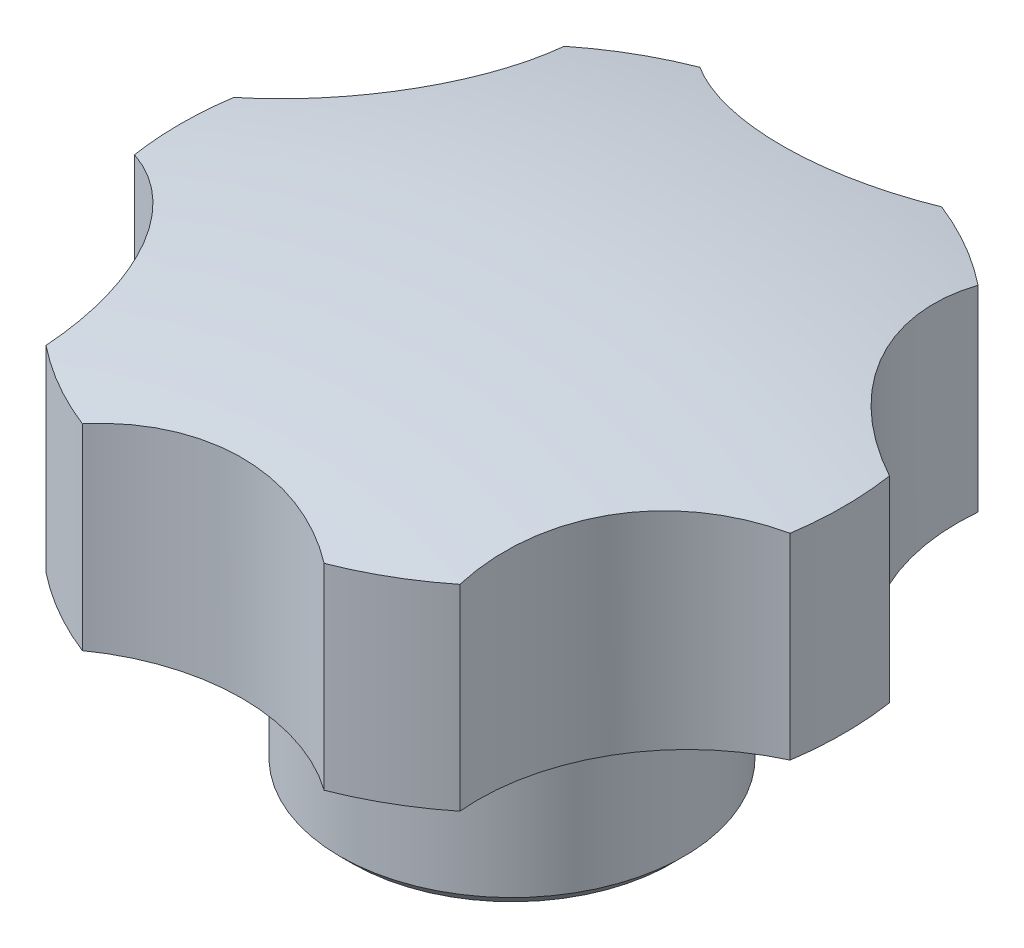
ISO-10303-21;
HEADER;
FILE_DESCRIPTION(('STEP AP214'),'2;1');
FILE_NAME('part.step','',(''),(''),'','','');
FILE_SCHEMA(('AUTOMOTIVE_DESIGN { 1 0 10303 214 1 1 1 1 }'));
ENDSEC;
DATA;
#1=APPLICATION_CONTEXT('core data for automotive mechanical design processes');
#2=APPLICATION_PROTOCOL_DEFINITION('international standard','automotive_design',2000,#1);
#3=PRODUCT_CONTEXT('',#1,'mechanical');
#4=PRODUCT('Part','Part','',(#3));
#5=PRODUCT_RELATED_PRODUCT_CATEGORY('part','',(#4));
#6=PRODUCT_DEFINITION_FORMATION('','',#4);
#7=PRODUCT_DEFINITION_CONTEXT('part definition',#1,'design');
#8=PRODUCT_DEFINITION('design','',#6,#7);
#9=PRODUCT_DEFINITION_SHAPE('','',#8);
#10=(LENGTH_UNIT() NAMED_UNIT(*) SI_UNIT(.MILLI.,.METRE.));
#11=(NAMED_UNIT(*) PLANE_ANGLE_UNIT() SI_UNIT($,.RADIAN.));
#12=(NAMED_UNIT(*) SI_UNIT($,.STERADIAN.) SOLID_ANGLE_UNIT());
#13=UNCERTAINTY_MEASURE_WITH_UNIT(LENGTH_MEASURE(1.E-05),#10,'distance_accuracy_value','');
#14=(GEOMETRIC_REPRESENTATION_CONTEXT(3) GLOBAL_UNCERTAINTY_ASSIGNED_CONTEXT((#13)) GLOBAL_UNIT_ASSIGNED_CONTEXT((#10,
#11,#12)) REPRESENTATION_CONTEXT('',''));
#15=CARTESIAN_POINT('',(0.,0.,0.));
#16=DIRECTION('',(0.,0.,1.));
#17=DIRECTION('',(1.,0.,0.));
#18=AXIS2_PLACEMENT_3D('',#15,#16,#17);
#19=CARTESIAN_POINT('',(0.,51.0944881889764,0.));
#20=DIRECTION('',(0.,1.,0.));
#21=DIRECTION('',(0.,0.,1.));
#22=AXIS2_PLACEMENT_3D('',#19,#20,#21);
#23=CYLINDRICAL_SURFACE('',#22,27.);
#24=DIRECTION('',(0.,-1.,0.));
#25=VECTOR('',#24,1.);
#26=CARTESIAN_POINT('',(-16.850144874763,8.08262341237582,21.0967442440652));
#27=LINE('',#26,#25);
#28=CARTESIAN_POINT('',(-16.850144874763,-1.33475317524839,21.0967442440652));
#29=VERTEX_POINT('',#28);
#30=CARTESIAN_POINT('',(-16.850144874763,14.6652468247516,21.0967442440652));
#31=VERTEX_POINT('',#30);
#32=EDGE_CURVE('E11',#29,#31,#27,.F.);
#33=ORIENTED_EDGE('',*,*,#32,.F.);
#34=CARTESIAN_POINT('',(0.,-1.33475317524839,0.));
#35=DIRECTION('',(0.,1.,0.));
#36=DIRECTION('',(0.,0.,1.));
#37=AXIS2_PLACEMENT_3D('',#34,#35,#36);
#38=CIRCLE('',#37,27.);
#39=CARTESIAN_POINT('',(-9.84524401512177,-1.33475317524839,25.1410256410256));
#40=VERTEX_POINT('',#39);
#41=EDGE_CURVE('E215',#29,#40,#38,.T.);
#42=ORIENTED_EDGE('',*,*,#41,.T.);
#43=DIRECTION('',(0.,-1.,0.));
#44=VECTOR('',#43,1.);
#45=CARTESIAN_POINT('',(-9.84524401512178,8.08262341237582,25.1410256410256));
#46=LINE('',#45,#44);
#47=CARTESIAN_POINT('',(-9.84524401512179,14.6652468247516,25.1410256410256));
#48=VERTEX_POINT('',#47);
#49=EDGE_CURVE('E238',#48,#40,#46,.T.);
#50=ORIENTED_EDGE('',*,*,#49,.F.);
#51=CARTESIAN_POINT('',(0.,14.6652468247516,0.));
#52=DIRECTION('',(0.,1.,0.));
#53=DIRECTION('',(0.,0.,1.));
#54=AXIS2_PLACEMENT_3D('',#51,#52,#53);
#55=CIRCLE('',#54,27.);
#56=EDGE_CURVE('E208',#31,#48,#55,.T.);
#57=ORIENTED_EDGE('',*,*,#56,.F.);
#58=EDGE_LOOP('',(#33,#42,#50,#57));
#59=FACE_BOUND('',#58,.T.);
#60=ADVANCED_FACE('F41',(#59),#23,.T.);
#61=DIRECTION('',(0.,-1.,0.));
#62=VECTOR('',#61,1.);
#63=CARTESIAN_POINT('',(-26.695388889885,8.08262341237582,4.04428139696097));
#64=LINE('',#63,#62);
#65=CARTESIAN_POINT('',(-26.695388889885,14.6652468247516,4.04428139696096));
#66=VERTEX_POINT('',#65);
#67=CARTESIAN_POINT('',(-26.695388889885,-1.33475317524839,4.04428139696097));
#68=VERTEX_POINT('',#67);
#69=EDGE_CURVE('E51',#66,#68,#64,.T.);
#70=ORIENTED_EDGE('',*,*,#69,.F.);
#71=CARTESIAN_POINT('',(-26.6953888898851,14.6652468247516,-4.04428139696041));
#72=VERTEX_POINT('',#71);
#73=EDGE_CURVE('E374',#72,#66,#55,.T.);
#74=ORIENTED_EDGE('',*,*,#73,.F.);
#75=DIRECTION('',(0.,-1.,0.));
#76=VECTOR('',#75,1.);
#77=CARTESIAN_POINT('',(-26.6953888898851,8.08262341237582,-4.04428139696041));
#78=LINE('',#77,#76);
#79=CARTESIAN_POINT('',(-26.6953888898851,-1.33475317524839,-4.04428139696041));
#80=VERTEX_POINT('',#79);
#81=EDGE_CURVE('E266',#80,#72,#78,.F.);
#82=ORIENTED_EDGE('',*,*,#81,.F.);
#83=EDGE_CURVE('E281',#80,#68,#38,.T.);
#84=ORIENTED_EDGE('',*,*,#83,.T.);
#85=EDGE_LOOP('',(#70,#74,#82,#84));
#86=FACE_BOUND('',#85,.T.);
#87=ADVANCED_FACE('F284',(#86),#23,.T.);
#88=DIRECTION('',(0.,-1.,0.));
#89=VECTOR('',#88,1.);
#90=CARTESIAN_POINT('',(-16.8501448747635,8.08262341237582,-21.0967442440648));
#91=LINE('',#90,#89);
#92=CARTESIAN_POINT('',(-16.8501448747634,14.6652468247516,-21.0967442440648));
#93=VERTEX_POINT('',#92);
#94=CARTESIAN_POINT('',(-16.8501448747635,-1.33475317524839,-21.0967442440648));
#95=VERTEX_POINT('',#94);
#96=EDGE_CURVE('E263',#93,#95,#91,.T.);
#97=ORIENTED_EDGE('',*,*,#96,.F.);
#98=CARTESIAN_POINT('',(-9.84524401512177,14.6652468247516,-25.1410256410256));
#99=VERTEX_POINT('',#98);
#100=EDGE_CURVE('E370',#99,#93,#55,.T.);
#101=ORIENTED_EDGE('',*,*,#100,.F.);
#102=DIRECTION('',(0.,-1.,0.));
#103=VECTOR('',#102,1.);
#104=CARTESIAN_POINT('',(-9.84524401512178,8.08262341237582,-25.1410256410256));
#105=LINE('',#104,#103);
#106=CARTESIAN_POINT('',(-9.84524401512177,-1.33475317524839,-25.1410256410256));
#107=VERTEX_POINT('',#106);
#108=EDGE_CURVE('E260',#107,#99,#105,.F.);
#109=ORIENTED_EDGE('',*,*,#108,.F.);
#110=EDGE_CURVE('E286',#107,#95,#38,.T.);
#111=ORIENTED_EDGE('',*,*,#110,.T.);
#112=EDGE_LOOP('',(#97,#101,#109,#111));
#113=FACE_BOUND('',#112,.T.);
#114=ADVANCED_FACE('F335',(#113),#23,.T.);
#115=DIRECTION('',(0.,-1.,0.));
#116=VECTOR('',#115,1.);
#117=CARTESIAN_POINT('',(9.84524401512178,8.08262341237582,-25.1410256410256));
#118=LINE('',#117,#116);
#119=CARTESIAN_POINT('',(9.84524401512177,14.6652468247516,-25.1410256410256));
#120=VERTEX_POINT('',#119);
#121=CARTESIAN_POINT('',(9.84524401512177,-1.33475317524839,-25.1410256410256));
#122=VERTEX_POINT('',#121);
#123=EDGE_CURVE('E257',#120,#122,#118,.T.);
#124=ORIENTED_EDGE('',*,*,#123,.F.);
#125=CARTESIAN_POINT('',(16.8501448747632,14.6652468247516,-21.0967442440651));
#126=VERTEX_POINT('',#125);
#127=EDGE_CURVE('E368',#126,#120,#55,.T.);
#128=ORIENTED_EDGE('',*,*,#127,.F.);
#129=DIRECTION('',(0.,-1.,0.));
#130=VECTOR('',#129,1.);
#131=CARTESIAN_POINT('',(16.8501448747632,8.08262341237582,-21.0967442440651));
#132=LINE('',#131,#130);
#133=CARTESIAN_POINT('',(16.8501448747632,-1.33475317524839,-21.0967442440651));
#134=VERTEX_POINT('',#133);
#135=EDGE_CURVE('E254',#134,#126,#132,.F.);
#136=ORIENTED_EDGE('',*,*,#135,.F.);
#137=EDGE_CURVE('E290',#134,#122,#38,.T.);
#138=ORIENTED_EDGE('',*,*,#137,.T.);
#139=EDGE_LOOP('',(#124,#128,#136,#138));
#140=FACE_BOUND('',#139,.T.);
#141=ADVANCED_FACE('F347',(#140),#23,.T.);
#142=DIRECTION('',(0.,-1.,0.));
#143=VECTOR('',#142,1.);
#144=CARTESIAN_POINT('',(26.695388889885,8.08262341237582,-4.04428139696079));
#145=LINE('',#144,#143);
#146=CARTESIAN_POINT('',(26.695388889885,14.6652468247516,-4.04428139696078));
#147=VERTEX_POINT('',#146);
#148=CARTESIAN_POINT('',(26.695388889885,-1.33475317524839,-4.04428139696078));
#149=VERTEX_POINT('',#148);
#150=EDGE_CURVE('E251',#147,#149,#145,.T.);
#151=ORIENTED_EDGE('',*,*,#150,.F.);
#152=CARTESIAN_POINT('',(26.695388889885,14.6652468247516,4.04428139696059));
#153=VERTEX_POINT('',#152);
#154=EDGE_CURVE('E216',#153,#147,#55,.T.);
#155=ORIENTED_EDGE('',*,*,#154,.F.);
#156=DIRECTION('',(0.,-1.,0.));
#157=VECTOR('',#156,1.);
#158=CARTESIAN_POINT('',(26.695388889885,8.08262341237582,4.0442813969606));
#159=LINE('',#158,#157);
#160=CARTESIAN_POINT('',(26.695388889885,-1.33475317524839,4.04428139696059));
#161=VERTEX_POINT('',#160);
#162=EDGE_CURVE('E248',#161,#153,#159,.F.);
#163=ORIENTED_EDGE('',*,*,#162,.F.);
#164=EDGE_CURVE('E222',#161,#149,#38,.T.);
#165=ORIENTED_EDGE('',*,*,#164,.T.);
#166=EDGE_LOOP('',(#151,#155,#163,#165));
#167=FACE_BOUND('',#166,.T.);
#168=ADVANCED_FACE('F338',(#167),#23,.T.);
#169=CARTESIAN_POINT('',(0.,-112.5,0.));
#170=DIRECTION('',(0.,1.,0.));
#171=DIRECTION('',(-1.,0.,0.));
#172=AXIS2_PLACEMENT_3D('',#169,#170,#171);
#173=SPHERICAL_SURFACE('',#172,130.);
#174=CARTESIAN_POINT('',(-16.8501637445967,14.6652111441769,21.0969442440652));
#175=CARTESIAN_POINT('',(-16.8070413013021,14.7466688632916,20.6404213237583));
#176=CARTESIAN_POINT('',(-16.7824070403024,14.8235319502256,20.1813352252558));
#177=CARTESIAN_POINT('',(-16.7704533709237,14.9675571036534,19.2611101541987));
#178=CARTESIAN_POINT('',(-16.7831382340029,15.0347180587411,18.7999709526827));
#179=CARTESIAN_POINT('',(-16.8461817709898,15.1588288644116,17.8786664923407));
#180=CARTESIAN_POINT('',(-16.8965529262544,15.2157753242984,17.4185016068446));
#181=CARTESIAN_POINT('',(-17.0002914915884,15.2931621761796,16.7317689280153));
#182=CARTESIAN_POINT('',(-17.0395688366349,15.3176193131575,16.5034401963426));
#183=CARTESIAN_POINT('',(-17.1274928542011,15.3638215252972,16.0482526350894));
#184=CARTESIAN_POINT('',(-17.1761420144331,15.38556587783,15.8213942123607));
#185=CARTESIAN_POINT('',(-17.3361763754958,15.446692768339,15.1432586787924));
#186=CARTESIAN_POINT('',(-17.4615862906221,15.4819226898528,14.6948334251709));
#187=CARTESIAN_POINT('',(-17.7490544752154,15.5409972705339,13.8091177377044));
#188=CARTESIAN_POINT('',(-17.9111122456536,15.5648420847168,13.3718271523305));
#189=CARTESIAN_POINT('',(-18.1807785067103,15.5919187260886,12.7269020722601));
#190=CARTESIAN_POINT('',(-18.2750782598536,15.5994952739696,12.5137987177617));
#191=CARTESIAN_POINT('',(-18.4723634101261,15.6117421170984,12.0916349352487));
#192=CARTESIAN_POINT('',(-18.5753465577786,15.6164131624204,11.8825734773068));
#193=CARTESIAN_POINT('',(-18.8971108368076,15.6260521024691,11.261931803013));
#194=CARTESIAN_POINT('',(-19.1287304711451,15.6266481758142,10.8568376930189));
#195=CARTESIAN_POINT('',(-19.6203916248729,15.6162523490463,10.0735593541941));
#196=CARTESIAN_POINT('',(-19.879917637532,15.6054461757764,9.69504770317632));
#197=CARTESIAN_POINT('',(-20.4284744108658,15.5726231688262,8.96052297549577));
#198=CARTESIAN_POINT('',(-20.7175059735483,15.5506060303492,8.6045105108228));
#199=CARTESIAN_POINT('',(-21.3230210339595,15.4955283522969,7.91732826985142));
#200=CARTESIAN_POINT('',(-21.6395157989238,15.4624632641065,7.58616879480564));
#201=CARTESIAN_POINT('',(-22.2974675410807,15.3855579608999,6.95107751438354));
#202=CARTESIAN_POINT('',(-22.638921163757,15.3417191920222,6.64714206222356));
#203=CARTESIAN_POINT('',(-23.2752635800438,15.2532101237161,6.12500592320841));
#204=CARTESIAN_POINT('',(-23.5662079801235,15.2103773745234,5.90165957930446));
#205=CARTESIAN_POINT('',(-24.1612034596133,15.118181006556,5.47469626570265));
#206=CARTESIAN_POINT('',(-24.4652529664011,15.0688181699337,5.27107693821969));
#207=CARTESIAN_POINT('',(-25.0845208524167,14.963888122335,4.88464244816682));
#208=CARTESIAN_POINT('',(-25.3997192810911,14.9083316457137,4.70179236730079));
#209=CARTESIAN_POINT('',(-26.0403477116057,14.7912093773338,4.35708783485254));
#210=CARTESIAN_POINT('',(-26.3657784627835,14.7296431447683,4.19523492541361));
#211=CARTESIAN_POINT('',(-26.695588889885,14.6652077527031,4.04418978710369));
#212=B_SPLINE_CURVE_WITH_KNOTS('',3,(#174,#175,#176,#177,#178,#179,#180,#181,#182,#183,#184,
#185,#186,#187,#188,#189,#190,#191,#192,#193,#194,#195,#196,#197,#198,#199,#200,#201,#202,#203,
#204,#205,#206,#207,#208,#209,#210,#211),.UNSPECIFIED.,.F.,.F.,(4,2,2,2,2,2,2,2,2,2,2,2,2,2,2,2,
2,2,4),(0.,1.39679114402809,2.79374216766981,4.19115605369288,4.88988528541168,5.58880024833288,
6.98788412352493,8.38694894873701,9.08623524728681,9.78534094554907,11.1833687895575,
12.5589711663475,13.9346109441608,15.3108177939,16.686840017813,17.7938914500612,
18.9008104031853,20.0058399060644,21.1109505222609),.UNSPECIFIED.);
#213=EDGE_CURVE('E57',#31,#66,#212,.T.);
#214=ORIENTED_EDGE('',*,*,#213,.F.);
#215=ORIENTED_EDGE('',*,*,#56,.T.);
#216=CARTESIAN_POINT('',(9.84544401512177,14.6652032506673,25.141167720724));
#217=CARTESIAN_POINT('',(9.471645448272,14.74666128246,24.8755601261871));
#218=CARTESIAN_POINT('',(9.08638297085149,14.8235246897973,24.6246821499549));
#219=CARTESIAN_POINT('',(8.29542265872542,14.9675504973937,24.1542153217896));
#220=CARTESIAN_POINT('',(7.8897224899787,15.0347117862411,23.9346300545851));
#221=CARTESIAN_POINT('',(7.06032860352918,15.1588232717314,23.5285729236999));
#222=CARTESIAN_POINT('',(6.63662896810968,15.2157700774988,23.3421120564367));
#223=CARTESIAN_POINT('',(5.99003229886148,15.2931574541458,23.088584240493));
#224=CARTESIAN_POINT('',(5.77265531801916,15.3176147670376,23.0084344796747));
#225=CARTESIAN_POINT('',(5.33448963956909,15.3638173327366,22.8569839780837));
#226=CARTESIAN_POINT('',(5.11370005044201,15.3855618629151,22.7856855951581));
#227=CARTESIAN_POINT('',(4.44640067425831,15.4466892889244,22.5852099002971));
#228=CARTESIAN_POINT('',(3.99534827166216,15.481919570311,22.4696042679616));
#229=CARTESIAN_POINT('',(3.08456221933043,15.540994873035,22.2756988090511));
#230=CARTESIAN_POINT('',(2.62482868788412,15.56484004939,22.197398474534));
#231=CARTESIAN_POINT('',(1.93147414120135,15.5919172331554,22.1084719869631));
#232=CARTESIAN_POINT('',(1.69977136349122,15.5994939616376,22.0835856985799));
#233=CARTESIAN_POINT('',(1.23552423638448,15.6117411654266,22.043356574922));
#234=CARTESIAN_POINT('',(1.00298011978993,15.6164123908079,22.0280112765794));
#235=CARTESIAN_POINT('',(0.304606455870692,15.6260518697407,21.99634470895));
#236=CARTESIAN_POINT('',(-0.162025250049129,15.6266483006611,21.9943849664597));
#237=CARTESIAN_POINT('',(-1.08619500004503,15.6162531774943,22.0285345349121));
#238=CARTESIAN_POINT('',(-1.54375884525252,15.6054473519708,22.0640336871773));
#239=CARTESIAN_POINT('',(-2.45415467107692,15.5726250346691,22.1718331607064));
#240=CARTESIAN_POINT('',(-2.90698652271096,15.5506082381158,22.2441344824535));
#241=CARTESIAN_POINT('',(-3.80486190256673,15.4955312347031,22.4249325756522));
#242=CARTESIAN_POINT('',(-4.24990214308657,15.4624664789305,22.5334442564203));
#243=CARTESIAN_POINT('',(-5.1288839691332,15.3855618288022,22.7856994042004));
#244=CARTESIAN_POINT('',(-5.56282703551456,15.3417233805058,22.9294381429828));
#245=CARTESIAN_POINT('',(-6.33318748060469,15.2532142781651,23.2194588932272));
#246=CARTESIAN_POINT('',(-6.67208877809001,15.2103810745442,23.3597524557857));
#247=CARTESIAN_POINT('',(-7.3393582854106,15.1181835922108,23.6615556546006));
#248=CARTESIAN_POINT('',(-7.66772775078251,15.0688200956199,23.8230627501329));
#249=CARTESIAN_POINT('',(-8.31203383711156,14.9638885318095,24.1661521867708));
#250=CARTESIAN_POINT('',(-8.62799072288555,14.9083311989371,24.3476997910669));
#251=CARTESIAN_POINT('',(-9.24683711830454,14.7912070362386,24.7301542015156));
#252=CARTESIAN_POINT('',(-9.54972566717772,14.7296397656495,24.9310624275437));
#253=CARTESIAN_POINT('',(-9.84544401512177,14.6652032506673,25.141167720724));
#254=B_SPLINE_CURVE_WITH_KNOTS('',3,(#216,#217,#218,#219,#220,#221,#222,#223,#224,#225,#226,
#227,#228,#229,#230,#231,#232,#233,#234,#235,#236,#237,#238,#239,#240,#241,#242,#243,#244,#245,
#246,#247,#248,#249,#250,#251,#252,#253),.UNSPECIFIED.,.F.,.F.,(4,2,2,2,2,2,2,2,2,2,2,2,2,2,2,2,
2,2,4),(0.,1.39679144021043,2.79374276111804,4.19115696950711,4.88988636229018,5.58880148638242,
6.98788569041844,8.38695084423601,9.08623729800444,9.78534315144271,11.183371306075,
12.55897379187,13.9346136760206,15.3108206688538,16.6868430461445,17.7939114131476,
18.9008473083549,20.0058937843056,21.1110213642782),.UNSPECIFIED.);
#255=CARTESIAN_POINT('',(9.84524401512177,14.6652468247516,25.1410256410256));
#256=VERTEX_POINT('',#255);
#257=EDGE_CURVE('E199',#256,#48,#254,.T.);
#258=ORIENTED_EDGE('',*,*,#257,.F.);
#259=CARTESIAN_POINT('',(16.8501448747633,14.6652468247516,21.0967442440649));
#260=VERTEX_POINT('',#259);
#261=EDGE_CURVE('E211',#256,#260,#55,.T.);
#262=ORIENTED_EDGE('',*,*,#261,.T.);
#263=CARTESIAN_POINT('',(26.6955888898851,14.6652077527031,4.04418978710332));
#264=CARTESIAN_POINT('',(26.2786669890884,14.746665606332,4.23510565601676));
#265=CARTESIAN_POINT('',(25.8687693825465,14.8235288310802,4.44331435921947));
#266=CARTESIAN_POINT('',(25.0658537172317,14.9675542658356,4.8930738360227));
#267=CARTESIAN_POINT('',(24.6728375959027,15.0347153644344,5.13462842330877));
#268=CARTESIAN_POINT('',(23.9064856806537,15.1588264621069,5.6498771313363));
#269=CARTESIAN_POINT('',(23.5331564507829,15.2157730704504,5.92358187470624));
#270=CARTESIAN_POINT('',(22.9902972731734,15.2931601476034,6.35678787104328));
#271=CARTESIAN_POINT('',(22.8121972879418,15.3176173601034,6.50496722733234));
#272=CARTESIAN_POINT('',(22.4619549457892,15.3638197240426,6.80870507253984));
#273=CARTESIAN_POINT('',(22.2898141850665,15.3855641528529,6.96426551245694));
#274=CARTESIAN_POINT('',(21.7825482029268,15.4466912733037,7.44192657413753));
#275=CARTESIAN_POINT('',(21.4569051080632,15.4819213493689,7.77474703899283));
#276=CARTESIAN_POINT('',(20.8335861055088,15.5409962401938,8.46655900214279));
#277=CARTESIAN_POINT('',(20.5359098170741,15.5648412099699,8.82555014402812));
#278=CARTESIAN_POINT('',(20.1122208010783,15.591918084444,9.38155010140874));
#279=CARTESIAN_POINT('',(19.9748175417599,15.599494709963,9.5697676269784));
#280=CARTESIAN_POINT('',(19.7078551170175,15.6117417081209,9.9517032135206));
#281=CARTESIAN_POINT('',(19.5782939349135,15.6164128308341,10.1454198413502));
#282=CARTESIAN_POINT('',(19.2016839436387,15.6260520024777,10.7343963644137));
#283=CARTESIAN_POINT('',(18.9666715117388,15.6266482294705,11.1375316919378));
#284=CARTESIAN_POINT('',(18.5341622368954,15.6162527049634,11.9549615044078));
#285=CARTESIAN_POINT('',(18.3361240829936,15.605446680999,12.368973256844));
#286=CARTESIAN_POINT('',(17.9742844729358,15.572623969985,13.2112993774181));
#287=CARTESIAN_POINT('',(17.8104839477823,15.5506069781384,13.6396141341214));
#288=CARTESIAN_POINT('',(17.5181232553825,15.4955295895986,14.5075964182568));
#289=CARTESIAN_POINT('',(17.3895776428617,15.4624646442996,14.947268552781));
#290=CARTESIAN_POINT('',(17.1685473730584,15.3855596219866,15.834616939291));
#291=CARTESIAN_POINT('',(17.0760578803042,15.3417209911138,16.282292109565));
#292=CARTESIAN_POINT('',(16.9420450788196,15.2532121797384,17.0944486725962));
#293=CARTESIAN_POINT('',(16.8940932957713,15.2103795527524,17.4580869404735));
#294=CARTESIAN_POINT('',(16.8218291946991,15.1181834292686,18.1868495325122));
#295=CARTESIAN_POINT('',(16.7975140484584,15.0688207149249,18.5519736736318));
#296=CARTESIAN_POINT('',(16.7724851163354,14.9638909110643,19.2814924282256));
#297=CARTESIAN_POINT('',(16.7717311150807,14.9083345558995,19.6458872231154));
#298=CARTESIAN_POINT('',(16.7935216377672,14.791212529224,20.3730398283631));
#299=CARTESIAN_POINT('',(16.81606787192,14.7296464169042,20.7357975165961));
#300=CARTESIAN_POINT('',(16.850163744597,14.6652111441769,21.0969442440649));
#301=B_SPLINE_CURVE_WITH_KNOTS('',3,(#263,#264,#265,#266,#267,#268,#269,#270,#271,#272,#273,
#274,#275,#276,#277,#278,#279,#280,#281,#282,#283,#284,#285,#286,#287,#288,#289,#290,#291,#292,
#293,#294,#295,#296,#297,#298,#299,#300),.UNSPECIFIED.,.F.,.F.,(4,2,2,2,2,2,2,2,2,2,2,2,2,2,2,2,
2,2,4),(0.,1.39679127421152,2.79374242850509,4.19115645011494,4.88988574956545,5.58880078026291,
6.98788479347806,8.38694975661296,9.08623612355395,9.78534189019013,11.1833698707877,
12.5589723032915,13.9346121368278,15.3108190409388,16.6868413189448,17.7938924252892,
18.9008110522881,20.0058402303284,21.1109505220506),.UNSPECIFIED.);
#302=EDGE_CURVE('E164',#153,#260,#301,.T.);
#303=ORIENTED_EDGE('',*,*,#302,.F.);
#304=ORIENTED_EDGE('',*,*,#154,.T.);
#305=CARTESIAN_POINT('',(16.8501637445969,14.6652111441769,-21.0969442440651));
#306=CARTESIAN_POINT('',(16.8070413013022,14.7466688632916,-20.6404213237582));
#307=CARTESIAN_POINT('',(16.7824070403025,14.8235319502256,-20.1813352252556));
#308=CARTESIAN_POINT('',(16.7704533709238,14.9675571036534,-19.2611101541985));
#309=CARTESIAN_POINT('',(16.783138234003,15.0347180587411,-18.7999709526825));
#310=CARTESIAN_POINT('',(16.8461817709899,15.1588288644116,-17.8786664923406));
#311=CARTESIAN_POINT('',(16.8965529262545,15.2157753242984,-17.4185016068445));
#312=CARTESIAN_POINT('',(17.0002914915885,15.2931621761796,-16.7317689280152));
#313=CARTESIAN_POINT('',(17.0395688366351,15.3176193131575,-16.5034401963425));
#314=CARTESIAN_POINT('',(17.1274928542013,15.3638215252972,-16.0482526350893));
#315=CARTESIAN_POINT('',(17.1761420144333,15.38556587783,-15.8213942123605));
#316=CARTESIAN_POINT('',(17.3361763754959,15.446692768339,-15.1432586787923));
#317=CARTESIAN_POINT('',(17.4615862906222,15.4819226898528,-14.6948334251708));
#318=CARTESIAN_POINT('',(17.7490544752155,15.5409972705339,-13.8091177377043));
#319=CARTESIAN_POINT('',(17.9111122456537,15.5648420847168,-13.3718271523303));
#320=CARTESIAN_POINT('',(18.1807785067104,15.5919187260886,-12.72690207226));
#321=CARTESIAN_POINT('',(18.2750782598537,15.5994952739696,-12.5137987177616));
#322=CARTESIAN_POINT('',(18.4723634101261,15.6117421170984,-12.0916349352486));
#323=CARTESIAN_POINT('',(18.5753465577787,15.6164131624204,-11.8825734773067));
#324=CARTESIAN_POINT('',(18.8971108368077,15.6260521024691,-11.2619318030129));
#325=CARTESIAN_POINT('',(19.1287304711451,15.6266481758142,-10.8568376930188));
#326=CARTESIAN_POINT('',(19.620391624873,15.6162523490463,-10.073559354194));
#327=CARTESIAN_POINT('',(19.8799176375321,15.6054461757763,-9.69504770317618));
#328=CARTESIAN_POINT('',(20.4284744108659,15.5726231688262,-8.96052297549563));
#329=CARTESIAN_POINT('',(20.7175059735483,15.5506060303492,-8.60451051082265));
#330=CARTESIAN_POINT('',(21.3230210339595,15.495528352297,-7.91732826985127));
#331=CARTESIAN_POINT('',(21.6395157989238,15.4624632641064,-7.58616879480549));
#332=CARTESIAN_POINT('',(22.2974675410807,15.3855579608998,-6.95107751438339));
#333=CARTESIAN_POINT('',(22.6389211637571,15.3417191920222,-6.6471420622234));
#334=CARTESIAN_POINT('',(23.2752635800438,15.2532101237161,-6.12500592320825));
#335=CARTESIAN_POINT('',(23.5662079801235,15.2103773745234,-5.90165957930429));
#336=CARTESIAN_POINT('',(24.1612034596134,15.118181006556,-5.47469626570248));
#337=CARTESIAN_POINT('',(24.4652529664011,15.0688181699337,-5.27107693821952));
#338=CARTESIAN_POINT('',(25.0845208524167,14.963888122335,-4.88464244816665));
#339=CARTESIAN_POINT('',(25.3997192810911,14.9083316457137,-4.70179236730061));
#340=CARTESIAN_POINT('',(26.0403477116057,14.7912093773339,-4.35708783485236));
#341=CARTESIAN_POINT('',(26.3657784627835,14.7296431447684,-4.19523492541343));
#342=CARTESIAN_POINT('',(26.695588889885,14.6652077527031,-4.0441897871035));
#343=B_SPLINE_CURVE_WITH_KNOTS('',3,(#305,#306,#307,#308,#309,#310,#311,#312,#313,#314,#315,
#316,#317,#318,#319,#320,#321,#322,#323,#324,#325,#326,#327,#328,#329,#330,#331,#332,#333,#334,
#335,#336,#337,#338,#339,#340,#341,#342),.UNSPECIFIED.,.F.,.F.,(4,2,2,2,2,2,2,2,2,2,2,2,2,2,2,2,
2,2,4),(0.,1.39679114402809,2.79374216766981,4.19115605369288,4.88988528541168,5.58880024833287,
6.98788412352492,8.386948948737,9.0862352472868,9.78534094554907,11.1833687895575,
12.5589711663475,13.9346109441608,15.3108177939,16.686840017813,17.7938914500612,
18.9008104031853,20.0058399060644,21.1109505222609),.UNSPECIFIED.);
#344=EDGE_CURVE('E172',#126,#147,#343,.T.);
#345=ORIENTED_EDGE('',*,*,#344,.F.);
#346=ORIENTED_EDGE('',*,*,#127,.T.);
#347=CARTESIAN_POINT('',(-9.84544401512178,14.6652032506673,-25.141167720724));
#348=CARTESIAN_POINT('',(-9.471645448272,14.74666128246,-24.8755601261871));
#349=CARTESIAN_POINT('',(-9.08638297085149,14.8235246897973,-24.6246821499549));
#350=CARTESIAN_POINT('',(-8.29542265872542,14.9675504973937,-24.1542153217896));
#351=CARTESIAN_POINT('',(-7.8897224899787,15.0347117862412,-23.9346300545851));
#352=CARTESIAN_POINT('',(-7.06032860352918,15.1588232717314,-23.5285729236999));
#353=CARTESIAN_POINT('',(-6.63662896810968,15.2157700774988,-23.3421120564367));
#354=CARTESIAN_POINT('',(-5.99003229886148,15.2931574541457,-23.088584240493));
#355=CARTESIAN_POINT('',(-5.77265531801916,15.3176147670375,-23.0084344796747));
#356=CARTESIAN_POINT('',(-5.33448963956909,15.3638173327366,-22.8569839780837));
#357=CARTESIAN_POINT('',(-5.11370005044201,15.3855618629151,-22.7856855951581));
#358=CARTESIAN_POINT('',(-4.44640067425831,15.4466892889244,-22.5852099002971));
#359=CARTESIAN_POINT('',(-3.99534827166216,15.481919570311,-22.4696042679616));
#360=CARTESIAN_POINT('',(-3.08456221933043,15.540994873035,-22.2756988090511));
#361=CARTESIAN_POINT('',(-2.62482868788412,15.56484004939,-22.197398474534));
#362=CARTESIAN_POINT('',(-1.93147414120135,15.5919172331554,-22.1084719869631));
#363=CARTESIAN_POINT('',(-1.69977136349122,15.5994939616376,-22.0835856985799));
#364=CARTESIAN_POINT('',(-1.23552423638448,15.6117411654266,-22.043356574922));
#365=CARTESIAN_POINT('',(-1.00298011978993,15.6164123908079,-22.0280112765794));
#366=CARTESIAN_POINT('',(-0.30460645587069,15.6260518697407,-21.99634470895));
#367=CARTESIAN_POINT('',(0.162025250049131,15.6266483006611,-21.9943849664597));
#368=CARTESIAN_POINT('',(1.08619500004504,15.6162531774943,-22.0285345349121));
#369=CARTESIAN_POINT('',(1.54375884525252,15.6054473519708,-22.0640336871773));
#370=CARTESIAN_POINT('',(2.45415467107693,15.5726250346691,-22.1718331607064));
#371=CARTESIAN_POINT('',(2.90698652271096,15.5506082381158,-22.2441344824535));
#372=CARTESIAN_POINT('',(3.80486190256673,15.4955312347031,-22.4249325756522));
#373=CARTESIAN_POINT('',(4.24990214308658,15.4624664789305,-22.5334442564203));
#374=CARTESIAN_POINT('',(5.1288839691332,15.3855618288022,-22.7856994042004));
#375=CARTESIAN_POINT('',(5.56282703551456,15.3417233805058,-22.9294381429828));
#376=CARTESIAN_POINT('',(6.33318748060469,15.2532142781652,-23.2194588932272));
#377=CARTESIAN_POINT('',(6.67208877809001,15.2103810745442,-23.3597524557857));
#378=CARTESIAN_POINT('',(7.3393582854106,15.1181835922108,-23.6615556546006));
#379=CARTESIAN_POINT('',(7.66772775078251,15.06882009562,-23.8230627501329));
#380=CARTESIAN_POINT('',(8.31203383711156,14.9638885318095,-24.1661521867708));
#381=CARTESIAN_POINT('',(8.62799072288555,14.9083311989371,-24.3476997910669));
#382=CARTESIAN_POINT('',(9.24683711830454,14.7912070362386,-24.7301542015156));
#383=CARTESIAN_POINT('',(9.54972566717772,14.7296397656495,-24.9310624275437));
#384=CARTESIAN_POINT('',(9.84544401512177,14.6652032506673,-25.141167720724));
#385=B_SPLINE_CURVE_WITH_KNOTS('',3,(#347,#348,#349,#350,#351,#352,#353,#354,#355,#356,#357,
#358,#359,#360,#361,#362,#363,#364,#365,#366,#367,#368,#369,#370,#371,#372,#373,#374,#375,#376,
#377,#378,#379,#380,#381,#382,#383,#384),.UNSPECIFIED.,.F.,.F.,(4,2,2,2,2,2,2,2,2,2,2,2,2,2,2,2,
2,2,4),(0.,1.39679144021044,2.79374276111804,4.19115696950712,4.88988636229019,5.58880148638243,
6.98788569041845,8.38695084423602,9.08623729800445,9.78534315144271,11.183371306075,
12.55897379187,13.9346136760206,15.3108206688538,16.6868430461445,17.7939114131476,
18.9008473083549,20.0058937843056,21.1110213642782),.UNSPECIFIED.);
#386=EDGE_CURVE('E301',#99,#120,#385,.T.);
#387=ORIENTED_EDGE('',*,*,#386,.F.);
#388=ORIENTED_EDGE('',*,*,#100,.T.);
#389=CARTESIAN_POINT('',(-26.6955888898851,14.6652077527031,-4.04418978710313));
#390=CARTESIAN_POINT('',(-26.2786669890885,14.746665606332,-4.23510565601657));
#391=CARTESIAN_POINT('',(-25.8687693825466,14.8235288310802,-4.44331435921929));
#392=CARTESIAN_POINT('',(-25.0658537172317,14.9675542658356,-4.89307383602253));
#393=CARTESIAN_POINT('',(-24.6728375959027,15.0347153644344,-5.13462842330859));
#394=CARTESIAN_POINT('',(-23.9064856806537,15.1588264621069,-5.64987713133613));
#395=CARTESIAN_POINT('',(-23.5331564507829,15.2157730704504,-5.92358187470607));
#396=CARTESIAN_POINT('',(-22.9902972731734,15.2931601476034,-6.35678787104311));
#397=CARTESIAN_POINT('',(-22.8121972879418,15.3176173601034,-6.50496722733217));
#398=CARTESIAN_POINT('',(-22.4619549457892,15.3638197240426,-6.80870507253967));
#399=CARTESIAN_POINT('',(-22.2898141850665,15.3855641528529,-6.96426551245678));
#400=CARTESIAN_POINT('',(-21.7825482029268,15.4466912733037,-7.44192657413738));
#401=CARTESIAN_POINT('',(-21.4569051080633,15.4819213493689,-7.77474703899268));
#402=CARTESIAN_POINT('',(-20.8335861055089,15.5409962401938,-8.46655900214265));
#403=CARTESIAN_POINT('',(-20.5359098170742,15.5648412099698,-8.82555014402798));
#404=CARTESIAN_POINT('',(-20.1122208010784,15.591918084444,-9.3815501014086));
#405=CARTESIAN_POINT('',(-19.9748175417599,15.599494709963,-9.56976762697825));
#406=CARTESIAN_POINT('',(-19.7078551170176,15.6117417081209,-9.95170321352046));
#407=CARTESIAN_POINT('',(-19.5782939349136,15.6164128308341,-10.1454198413501));
#408=CARTESIAN_POINT('',(-19.2016839436388,15.6260520024777,-10.7343963644136));
#409=CARTESIAN_POINT('',(-18.9666715117389,15.6266482294705,-11.1375316919377));
#410=CARTESIAN_POINT('',(-18.5341622368955,15.6162527049634,-11.9549615044076));
#411=CARTESIAN_POINT('',(-18.3361240829936,15.605446680999,-12.3689732568439));
#412=CARTESIAN_POINT('',(-17.9742844729358,15.572623969985,-13.211299377418));
#413=CARTESIAN_POINT('',(-17.8104839477824,15.5506069781384,-13.6396141341213));
#414=CARTESIAN_POINT('',(-17.5181232553826,15.4955295895986,-14.5075964182566));
#415=CARTESIAN_POINT('',(-17.3895776428618,15.4624646442996,-14.9472685527809));
#416=CARTESIAN_POINT('',(-17.1685473730586,15.3855596219866,-15.8346169392908));
#417=CARTESIAN_POINT('',(-17.0760578803043,15.3417209911138,-16.2822921095648));
#418=CARTESIAN_POINT('',(-16.9420450788197,15.2532121797384,-17.0944486725961));
#419=CARTESIAN_POINT('',(-16.8940932957714,15.2103795527524,-17.4580869404733));
#420=CARTESIAN_POINT('',(-16.8218291946993,15.1181834292686,-18.1868495325121));
#421=CARTESIAN_POINT('',(-16.7975140484585,15.0688207149249,-18.5519736736317));
#422=CARTESIAN_POINT('',(-16.7724851163355,14.9638909110643,-19.2814924282254));
#423=CARTESIAN_POINT('',(-16.7717311150808,14.9083345558995,-19.6458872231153));
#424=CARTESIAN_POINT('',(-16.7935216377673,14.791212529224,-20.3730398283629));
#425=CARTESIAN_POINT('',(-16.8160678719202,14.7296464169042,-20.7357975165959));
#426=CARTESIAN_POINT('',(-16.8501637445971,14.6652111441769,-21.0969442440648));
#427=B_SPLINE_CURVE_WITH_KNOTS('',3,(#389,#390,#391,#392,#393,#394,#395,#396,#397,#398,#399,
#400,#401,#402,#403,#404,#405,#406,#407,#408,#409,#410,#411,#412,#413,#414,#415,#416,#417,#418,
#419,#420,#421,#422,#423,#424,#425,#426),.UNSPECIFIED.,.F.,.F.,(4,2,2,2,2,2,2,2,2,2,2,2,2,2,2,2,
2,2,4),(0.,1.39679127421152,2.79374242850508,4.19115645011493,4.88988574956544,5.5888007802629,
6.98788479347806,8.38694975661296,9.08623612355395,9.78534189019013,11.1833698707877,
12.5589723032915,13.9346121368278,15.3108190409388,16.6868413189448,17.7938924252892,
18.9008110522881,20.0058402303284,21.1109505220506),.UNSPECIFIED.);
#428=EDGE_CURVE('E65',#72,#93,#427,.T.);
#429=ORIENTED_EDGE('',*,*,#428,.F.);
#430=ORIENTED_EDGE('',*,*,#73,.T.);
#431=EDGE_LOOP('',(#214,#215,#258,#262,#303,#304,#345,#346,#387,#388,#429,#430));
#432=FACE_BOUND('',#431,.T.);
#433=ADVANCED_FACE('F179',(#432),#173,.T.);
#434=CARTESIAN_POINT('',(0.,-17.5,0.));
#435=DIRECTION('',(0.,-1.,0.));
#436=DIRECTION('',(0.,0.,-1.));
#437=AXIS2_PLACEMENT_3D('',#434,#435,#436);
#438=PLANE('',#437);
#439=CARTESIAN_POINT('',(0.,-17.5,0.));
#440=DIRECTION('',(0.,-1.,0.));
#441=DIRECTION('',(0.,0.,-1.));
#442=AXIS2_PLACEMENT_3D('',#439,#440,#441);
#443=CIRCLE('',#442,4.99999999999999);
#444=CARTESIAN_POINT('',(0.,-17.5,-4.99999999999999));
#445=VERTEX_POINT('',#444);
#446=EDGE_CURVE('E144',#445,#445,#443,.T.);
#447=ORIENTED_EDGE('',*,*,#446,.F.);
#448=EDGE_LOOP('',(#447));
#449=FACE_BOUND('',#448,.T.);
#450=CARTESIAN_POINT('',(0.,-17.5,0.));
#451=DIRECTION('',(0.,-1.,0.));
#452=DIRECTION('',(0.,0.,-1.));
#453=AXIS2_PLACEMENT_3D('',#450,#451,#452);
#454=CIRCLE('',#453,13.);
#455=CARTESIAN_POINT('',(0.,-17.5,-13.));
#456=VERTEX_POINT('',#455);
#457=EDGE_CURVE('E234',#456,#456,#454,.T.);
#458=ORIENTED_EDGE('',*,*,#457,.T.);
#459=EDGE_LOOP('',(#458));
#460=FACE_BOUND('',#459,.T.);
#461=ADVANCED_FACE('F353',(#449,#460),#438,.T.);
#462=CARTESIAN_POINT('',(0.,51.0944881889764,0.));
#463=DIRECTION('',(0.,1.,0.));
#464=DIRECTION('',(0.,0.,1.));
#465=AXIS2_PLACEMENT_3D('',#462,#463,#464);
#466=CYLINDRICAL_SURFACE('',#465,14.);
#467=CARTESIAN_POINT('',(0.,-16.5,0.));
#468=DIRECTION('',(0.,-1.,0.));
#469=DIRECTION('',(0.,0.,-1.));
#470=AXIS2_PLACEMENT_3D('',#467,#468,#469);
#471=CIRCLE('',#470,14.);
#472=CARTESIAN_POINT('',(0.,-16.5,-14.));
#473=VERTEX_POINT('',#472);
#474=EDGE_CURVE('E230',#473,#473,#471,.F.);
#475=ORIENTED_EDGE('',*,*,#474,.T.);
#476=EDGE_LOOP('',(#475));
#477=FACE_BOUND('',#476,.T.);
#478=CARTESIAN_POINT('',(0.,-3.33475317524839,0.));
#479=DIRECTION('',(0.,1.,0.));
#480=DIRECTION('',(0.,0.,1.));
#481=AXIS2_PLACEMENT_3D('',#478,#479,#480);
#482=CIRCLE('',#481,14.);
#483=CARTESIAN_POINT('',(0.,-3.33475317524839,14.));
#484=VERTEX_POINT('',#483);
#485=EDGE_CURVE('E226',#484,#484,#482,.T.);
#486=ORIENTED_EDGE('',*,*,#485,.F.);
#487=EDGE_LOOP('',(#486));
#488=FACE_BOUND('',#487,.T.);
#489=ADVANCED_FACE('F464',(#477,#488),#466,.T.);
#490=CARTESIAN_POINT('',(0.,-3.33475317524839,0.));
#491=DIRECTION('',(0.,1.,0.));
#492=DIRECTION('',(0.,0.,1.));
#493=AXIS2_PLACEMENT_3D('',#490,#491,#492);
#494=TOROIDAL_SURFACE('',#493,16.,2.);
#495=ORIENTED_EDGE('',*,*,#485,.T.);
#496=EDGE_LOOP('',(#495));
#497=FACE_BOUND('',#496,.T.);
#498=CARTESIAN_POINT('',(0.,-1.33475317524839,0.));
#499=DIRECTION('',(0.,1.,0.));
#500=DIRECTION('',(0.,0.,1.));
#501=AXIS2_PLACEMENT_3D('',#498,#499,#500);
#502=CIRCLE('',#501,16.);
#503=CARTESIAN_POINT('',(0.,-1.33475317524839,16.));
#504=VERTEX_POINT('',#503);
#505=EDGE_CURVE('E221',#504,#504,#502,.T.);
#506=ORIENTED_EDGE('',*,*,#505,.F.);
#507=EDGE_LOOP('',(#506));
#508=FACE_BOUND('',#507,.T.);
#509=ADVANCED_FACE('F344',(#497,#508),#494,.F.);
#510=CARTESIAN_POINT('',(-16.,-1.33475317524839,0.));
#511=DIRECTION('',(0.,-1.,0.));
#512=DIRECTION('',(0.,0.,-1.));
#513=AXIS2_PLACEMENT_3D('',#510,#511,#512);
#514=PLANE('',#513);
#515=CARTESIAN_POINT('',(-33.7749907475929,-1.33475317524839,19.5000000000004));
#516=DIRECTION('',(0.,-1.,0.));
#517=DIRECTION('',(0.866025403784433,0.,-0.50000000000001));
#518=AXIS2_PLACEMENT_3D('',#515,#516,#517);
#519=CIRCLE('',#518,17.);
#520=EDGE_CURVE('E143',#68,#29,#519,.T.);
#521=ORIENTED_EDGE('',*,*,#520,.F.);
#522=ORIENTED_EDGE('',*,*,#83,.F.);
#523=CARTESIAN_POINT('',(-33.7749907475933,-1.33475317524839,-19.4999999999997));
#524=DIRECTION('',(0.,-1.,0.));
#525=DIRECTION('',(0.866025403784443,0.,0.499999999999992));
#526=AXIS2_PLACEMENT_3D('',#523,#524,#525);
#527=CIRCLE('',#526,17.);
#528=EDGE_CURVE('E148',#95,#80,#527,.T.);
#529=ORIENTED_EDGE('',*,*,#528,.F.);
#530=ORIENTED_EDGE('',*,*,#110,.F.);
#531=CARTESIAN_POINT('',(0.,-1.33475317524839,-39.));
#532=DIRECTION('',(0.,-1.,0.));
#533=DIRECTION('',(0.,0.,1.));
#534=AXIS2_PLACEMENT_3D('',#531,#532,#533);
#535=CIRCLE('',#534,17.);
#536=EDGE_CURVE('E157',#122,#107,#535,.T.);
#537=ORIENTED_EDGE('',*,*,#536,.F.);
#538=ORIENTED_EDGE('',*,*,#137,.F.);
#539=CARTESIAN_POINT('',(33.774990747593,-1.33475317524839,-19.5000000000002));
#540=DIRECTION('',(0.,-1.,0.));
#541=DIRECTION('',(-0.866025403784436,0.,0.500000000000004));
#542=AXIS2_PLACEMENT_3D('',#539,#540,#541);
#543=CIRCLE('',#542,17.);
#544=EDGE_CURVE('E153',#149,#134,#543,.T.);
#545=ORIENTED_EDGE('',*,*,#544,.F.);
#546=ORIENTED_EDGE('',*,*,#164,.F.);
#547=CARTESIAN_POINT('',(33.7749907475932,-1.33475317524839,19.4999999999999));
#548=DIRECTION('',(0.,-1.,0.));
#549=DIRECTION('',(-0.86602540378444,0.,-0.499999999999998));
#550=AXIS2_PLACEMENT_3D('',#547,#548,#549);
#551=CIRCLE('',#550,17.);
#552=CARTESIAN_POINT('',(16.8501448747633,-1.33475317524839,21.0967442440649));
#553=VERTEX_POINT('',#552);
#554=EDGE_CURVE('E156',#553,#161,#551,.T.);
#555=ORIENTED_EDGE('',*,*,#554,.F.);
#556=CARTESIAN_POINT('',(9.84524401512177,-1.33475317524839,25.1410256410256));
#557=VERTEX_POINT('',#556);
#558=EDGE_CURVE('E217',#557,#553,#38,.T.);
#559=ORIENTED_EDGE('',*,*,#558,.F.);
#560=CARTESIAN_POINT('',(0.,-1.33475317524839,39.));
#561=DIRECTION('',(0.,-1.,0.));
#562=DIRECTION('',(0.,0.,-1.));
#563=AXIS2_PLACEMENT_3D('',#560,#561,#562);
#564=CIRCLE('',#563,17.);
#565=EDGE_CURVE('E209',#40,#557,#564,.T.);
#566=ORIENTED_EDGE('',*,*,#565,.F.);
#567=ORIENTED_EDGE('',*,*,#41,.F.);
#568=EDGE_LOOP('',(#521,#522,#529,#530,#537,#538,#545,#546,#555,#559,#566,#567));
#569=FACE_BOUND('',#568,.T.);
#570=ORIENTED_EDGE('',*,*,#505,.T.);
#571=EDGE_LOOP('',(#570));
#572=FACE_BOUND('',#571,.T.);
#573=ADVANCED_FACE('F278',(#569,#572),#514,.T.);
#574=DIRECTION('',(0.,-1.,0.));
#575=VECTOR('',#574,1.);
#576=CARTESIAN_POINT('',(16.8501448747633,8.08262341237582,21.0967442440649));
#577=LINE('',#576,#575);
#578=EDGE_CURVE('E245',#260,#553,#577,.T.);
#579=ORIENTED_EDGE('',*,*,#578,.F.);
#580=ORIENTED_EDGE('',*,*,#261,.F.);
#581=DIRECTION('',(0.,-1.,0.));
#582=VECTOR('',#581,1.);
#583=CARTESIAN_POINT('',(9.84524401512178,8.08262341237582,25.1410256410256));
#584=LINE('',#583,#582);
#585=EDGE_CURVE('E242',#557,#256,#584,.F.);
#586=ORIENTED_EDGE('',*,*,#585,.F.);
#587=ORIENTED_EDGE('',*,*,#558,.T.);
#588=EDGE_LOOP('',(#579,#580,#586,#587));
#589=FACE_BOUND('',#588,.T.);
#590=ADVANCED_FACE('F196',(#589),#23,.T.);
#591=CARTESIAN_POINT('',(0.,-16.5,0.));
#592=DIRECTION('',(0.,1.,0.));
#593=DIRECTION('',(0.,0.,1.));
#594=AXIS2_PLACEMENT_3D('',#591,#592,#593);
#595=CONICAL_SURFACE('',#594,14.,0.785398163397453);
#596=ORIENTED_EDGE('',*,*,#457,.F.);
#597=EDGE_LOOP('',(#596));
#598=FACE_BOUND('',#597,.T.);
#599=ORIENTED_EDGE('',*,*,#474,.F.);
#600=EDGE_LOOP('',(#599));
#601=FACE_BOUND('',#600,.T.);
#602=ADVANCED_FACE('F44',(#598,#601),#595,.T.);
#603=CARTESIAN_POINT('',(0.,17.5,39.));
#604=DIRECTION('',(0.,-1.,0.));
#605=DIRECTION('',(0.,0.,-1.));
#606=AXIS2_PLACEMENT_3D('',#603,#604,#605);
#607=CYLINDRICAL_SURFACE('',#606,17.);
#608=ORIENTED_EDGE('',*,*,#257,.T.);
#609=ORIENTED_EDGE('',*,*,#49,.T.);
#610=ORIENTED_EDGE('',*,*,#565,.T.);
#611=ORIENTED_EDGE('',*,*,#585,.T.);
#612=EDGE_LOOP('',(#608,#609,#610,#611));
#613=FACE_BOUND('',#612,.T.);
#614=ADVANCED_FACE('F188',(#613),#607,.F.);
#615=CARTESIAN_POINT('',(33.7749907475932,17.5,19.4999999999999));
#616=DIRECTION('',(0.,-1.,0.));
#617=DIRECTION('',(0.,0.,-1.));
#618=AXIS2_PLACEMENT_3D('',#615,#616,#617);
#619=CYLINDRICAL_SURFACE('',#618,17.);
#620=ORIENTED_EDGE('',*,*,#302,.T.);
#621=ORIENTED_EDGE('',*,*,#578,.T.);
#622=ORIENTED_EDGE('',*,*,#554,.T.);
#623=ORIENTED_EDGE('',*,*,#162,.T.);
#624=EDGE_LOOP('',(#620,#621,#622,#623));
#625=FACE_BOUND('',#624,.T.);
#626=ADVANCED_FACE('F182',(#625),#619,.F.);
#627=CARTESIAN_POINT('',(33.774990747593,17.5,-19.5000000000002));
#628=DIRECTION('',(0.,-1.,0.));
#629=DIRECTION('',(0.,0.,-1.));
#630=AXIS2_PLACEMENT_3D('',#627,#628,#629);
#631=CYLINDRICAL_SURFACE('',#630,17.);
#632=ORIENTED_EDGE('',*,*,#344,.T.);
#633=ORIENTED_EDGE('',*,*,#150,.T.);
#634=ORIENTED_EDGE('',*,*,#544,.T.);
#635=ORIENTED_EDGE('',*,*,#135,.T.);
#636=EDGE_LOOP('',(#632,#633,#634,#635));
#637=FACE_BOUND('',#636,.T.);
#638=ADVANCED_FACE('F187',(#637),#631,.F.);
#639=CARTESIAN_POINT('',(0.,17.5,-39.));
#640=DIRECTION('',(0.,-1.,0.));
#641=DIRECTION('',(0.,0.,-1.));
#642=AXIS2_PLACEMENT_3D('',#639,#640,#641);
#643=CYLINDRICAL_SURFACE('',#642,17.);
#644=ORIENTED_EDGE('',*,*,#386,.T.);
#645=ORIENTED_EDGE('',*,*,#123,.T.);
#646=ORIENTED_EDGE('',*,*,#536,.T.);
#647=ORIENTED_EDGE('',*,*,#108,.T.);
#648=EDGE_LOOP('',(#644,#645,#646,#647));
#649=FACE_BOUND('',#648,.T.);
#650=ADVANCED_FACE('F319',(#649),#643,.F.);
#651=CARTESIAN_POINT('',(-33.7749907475933,17.5,-19.4999999999997));
#652=DIRECTION('',(0.,-1.,0.));
#653=DIRECTION('',(0.,0.,-1.));
#654=AXIS2_PLACEMENT_3D('',#651,#652,#653);
#655=CYLINDRICAL_SURFACE('',#654,17.);
#656=ORIENTED_EDGE('',*,*,#428,.T.);
#657=ORIENTED_EDGE('',*,*,#96,.T.);
#658=ORIENTED_EDGE('',*,*,#528,.T.);
#659=ORIENTED_EDGE('',*,*,#81,.T.);
#660=EDGE_LOOP('',(#656,#657,#658,#659));
#661=FACE_BOUND('',#660,.T.);
#662=ADVANCED_FACE('F316',(#661),#655,.F.);
#663=CARTESIAN_POINT('',(-33.7749907475929,17.5,19.5000000000004));
#664=DIRECTION('',(0.,-1.,0.));
#665=DIRECTION('',(0.,0.,-1.));
#666=AXIS2_PLACEMENT_3D('',#663,#664,#665);
#667=CYLINDRICAL_SURFACE('',#666,17.);
#668=ORIENTED_EDGE('',*,*,#213,.T.);
#669=ORIENTED_EDGE('',*,*,#69,.T.);
#670=ORIENTED_EDGE('',*,*,#520,.T.);
#671=ORIENTED_EDGE('',*,*,#32,.T.);
#672=EDGE_LOOP('',(#668,#669,#670,#671));
#673=FACE_BOUND('',#672,.T.);
#674=ADVANCED_FACE('F136',(#673),#667,.F.);
#675=CARTESIAN_POINT('',(0.,2.50000000000001,0.));
#676=DIRECTION('',(0.,-1.,0.));
#677=DIRECTION('',(0.,0.,-1.));
#678=AXIS2_PLACEMENT_3D('',#675,#676,#677);
#679=CONICAL_SURFACE('',#678,4.99999999999999,1.02974425867665);
#680=CARTESIAN_POINT('',(0.,5.50430309513781,0.));
#681=VERTEX_POINT('',#680);
#682=VERTEX_LOOP('',#681);
#683=FACE_BOUND('',#682,.T.);
#684=CARTESIAN_POINT('',(0.,2.50000000000001,0.));
#685=DIRECTION('',(0.,-1.,0.));
#686=DIRECTION('',(0.,0.,-1.));
#687=AXIS2_PLACEMENT_3D('',#684,#685,#686);
#688=CIRCLE('',#687,4.99999999999999);
#689=CARTESIAN_POINT('',(0.,2.50000000000001,-4.99999999999999));
#690=VERTEX_POINT('',#689);
#691=EDGE_CURVE('E140',#690,#690,#688,.T.);
#692=ORIENTED_EDGE('',*,*,#691,.T.);
#693=EDGE_LOOP('',(#692));
#694=FACE_BOUND('',#693,.T.);
#695=ADVANCED_FACE('F132',(#683,#694),#679,.F.);
#696=CARTESIAN_POINT('',(0.,-17.5,0.));
#697=DIRECTION('',(0.,-1.,0.));
#698=DIRECTION('',(0.,0.,-1.));
#699=AXIS2_PLACEMENT_3D('',#696,#697,#698);
#700=CYLINDRICAL_SURFACE('',#699,4.99999999999999);
#701=ORIENTED_EDGE('',*,*,#691,.F.);
#702=EDGE_LOOP('',(#701));
#703=FACE_BOUND('',#702,.T.);
#704=ORIENTED_EDGE('',*,*,#446,.T.);
#705=EDGE_LOOP('',(#704));
#706=FACE_BOUND('',#705,.T.);
#707=ADVANCED_FACE('F135',(#703,#706),#700,.F.);
#708=CLOSED_SHELL('',(#60,#87,#114,#141,#168,#433,#461,#489,#509,#573,#590,#602,#614,#626,#638,
#650,#662,#674,#695,#707));
#709=MANIFOLD_SOLID_BREP('B2',#708);
#710=ADVANCED_BREP_SHAPE_REPRESENTATION('',(#18,#709),#14);
#711=SHAPE_DEFINITION_REPRESENTATION(#9,#710);
ENDSEC;
END-ISO-10303-21;
